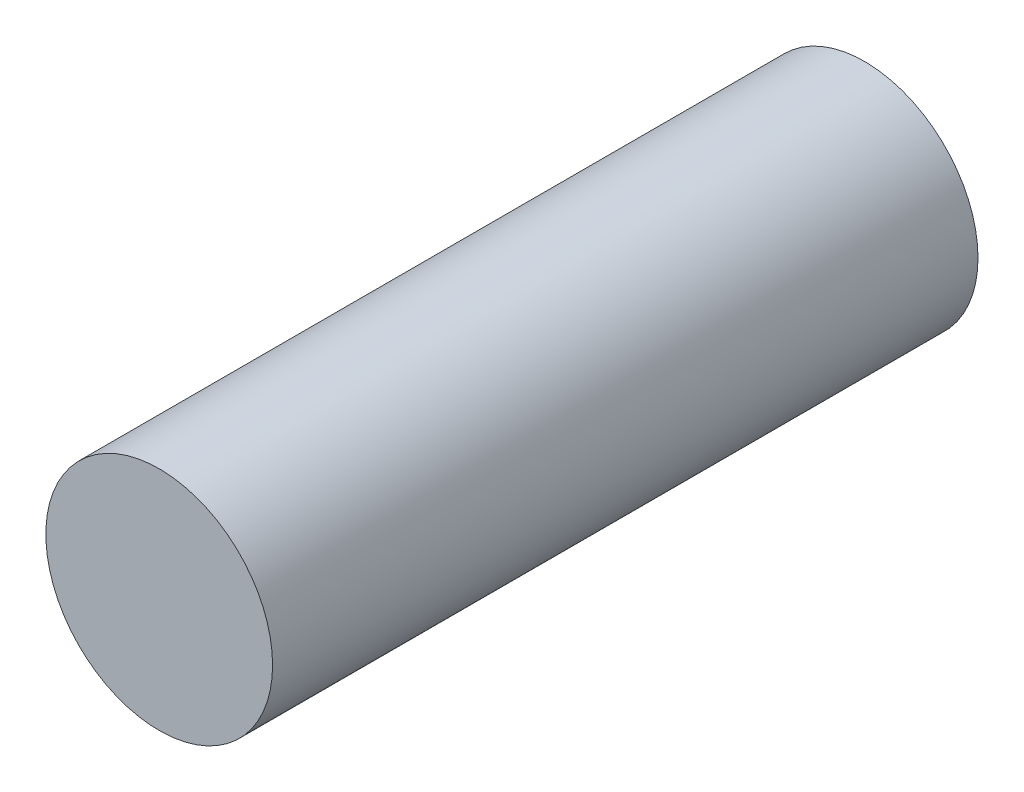
ISO-10303-21;
HEADER;
FILE_DESCRIPTION(('STEP AP214'),'2;1');
FILE_NAME('part.step','',(''),(''),'','','');
FILE_SCHEMA(('AUTOMOTIVE_DESIGN { 1 0 10303 214 1 1 1 1 }'));
ENDSEC;
DATA;
#1=APPLICATION_CONTEXT('core data for automotive mechanical design processes');
#2=APPLICATION_PROTOCOL_DEFINITION('international standard','automotive_design',2000,#1);
#3=PRODUCT_CONTEXT('',#1,'mechanical');
#4=PRODUCT('Part','Part','',(#3));
#5=PRODUCT_RELATED_PRODUCT_CATEGORY('part','',(#4));
#6=PRODUCT_DEFINITION_FORMATION('','',#4);
#7=PRODUCT_DEFINITION_CONTEXT('part definition',#1,'design');
#8=PRODUCT_DEFINITION('design','',#6,#7);
#9=PRODUCT_DEFINITION_SHAPE('','',#8);
#10=(LENGTH_UNIT() NAMED_UNIT(*) SI_UNIT(.MILLI.,.METRE.));
#11=(NAMED_UNIT(*) PLANE_ANGLE_UNIT() SI_UNIT($,.RADIAN.));
#12=(NAMED_UNIT(*) SI_UNIT($,.STERADIAN.) SOLID_ANGLE_UNIT());
#13=UNCERTAINTY_MEASURE_WITH_UNIT(LENGTH_MEASURE(1.E-05),#10,'distance_accuracy_value','');
#14=(GEOMETRIC_REPRESENTATION_CONTEXT(3) GLOBAL_UNCERTAINTY_ASSIGNED_CONTEXT((#13)) GLOBAL_UNIT_ASSIGNED_CONTEXT((#10,
#11,#12)) REPRESENTATION_CONTEXT('',''));
#15=CARTESIAN_POINT('',(0.,0.,0.));
#16=DIRECTION('',(0.,0.,1.));
#17=DIRECTION('',(1.,0.,0.));
#18=AXIS2_PLACEMENT_3D('',#15,#16,#17);
#19=CARTESIAN_POINT('',(0.,0.,28.));
#20=DIRECTION('',(0.,0.,-1.));
#21=DIRECTION('',(-1.,0.,0.));
#22=AXIS2_PLACEMENT_3D('',#19,#20,#21);
#23=CYLINDRICAL_SURFACE('',#22,4.5);
#24=CARTESIAN_POINT('',(0.,0.,28.));
#25=DIRECTION('',(0.,0.,1.));
#26=DIRECTION('',(1.,0.,0.));
#27=AXIS2_PLACEMENT_3D('',#24,#25,#26);
#28=CIRCLE('',#27,4.5);
#29=CARTESIAN_POINT('',(4.5,0.,28.));
#30=VERTEX_POINT('',#29);
#31=EDGE_CURVE('E10',#30,#30,#28,.T.);
#32=ORIENTED_EDGE('',*,*,#31,.F.);
#33=EDGE_LOOP('',(#32));
#34=FACE_BOUND('',#33,.T.);
#35=CARTESIAN_POINT('',(0.,0.,0.));
#36=DIRECTION('',(0.,0.,1.));
#37=DIRECTION('',(1.,0.,0.));
#38=AXIS2_PLACEMENT_3D('',#35,#36,#37);
#39=CIRCLE('',#38,4.5);
#40=CARTESIAN_POINT('',(4.5,0.,0.));
#41=VERTEX_POINT('',#40);
#42=EDGE_CURVE('E38',#41,#41,#39,.T.);
#43=ORIENTED_EDGE('',*,*,#42,.T.);
#44=EDGE_LOOP('',(#43));
#45=FACE_BOUND('',#44,.T.);
#46=ADVANCED_FACE('F35',(#34,#45),#23,.T.);
#47=CARTESIAN_POINT('',(0.,0.,28.));
#48=DIRECTION('',(0.,0.,1.));
#49=DIRECTION('',(1.,0.,0.));
#50=AXIS2_PLACEMENT_3D('',#47,#48,#49);
#51=PLANE('',#50);
#52=ORIENTED_EDGE('',*,*,#31,.T.);
#53=EDGE_LOOP('',(#52));
#54=FACE_BOUND('',#53,.T.);
#55=ADVANCED_FACE('F50',(#54),#51,.T.);
#56=CARTESIAN_POINT('',(0.,0.,0.));
#57=DIRECTION('',(0.,0.,1.));
#58=DIRECTION('',(1.,0.,0.));
#59=AXIS2_PLACEMENT_3D('',#56,#57,#58);
#60=PLANE('',#59);
#61=ORIENTED_EDGE('',*,*,#42,.F.);
#62=EDGE_LOOP('',(#61));
#63=FACE_BOUND('',#62,.T.);
#64=ADVANCED_FACE('F48',(#63),#60,.F.);
#65=CLOSED_SHELL('',(#46,#55,#64));
#66=MANIFOLD_SOLID_BREP('B2',#65);
#67=ADVANCED_BREP_SHAPE_REPRESENTATION('',(#18,#66),#14);
#68=SHAPE_DEFINITION_REPRESENTATION(#9,#67);
ENDSEC;
END-ISO-10303-21;
